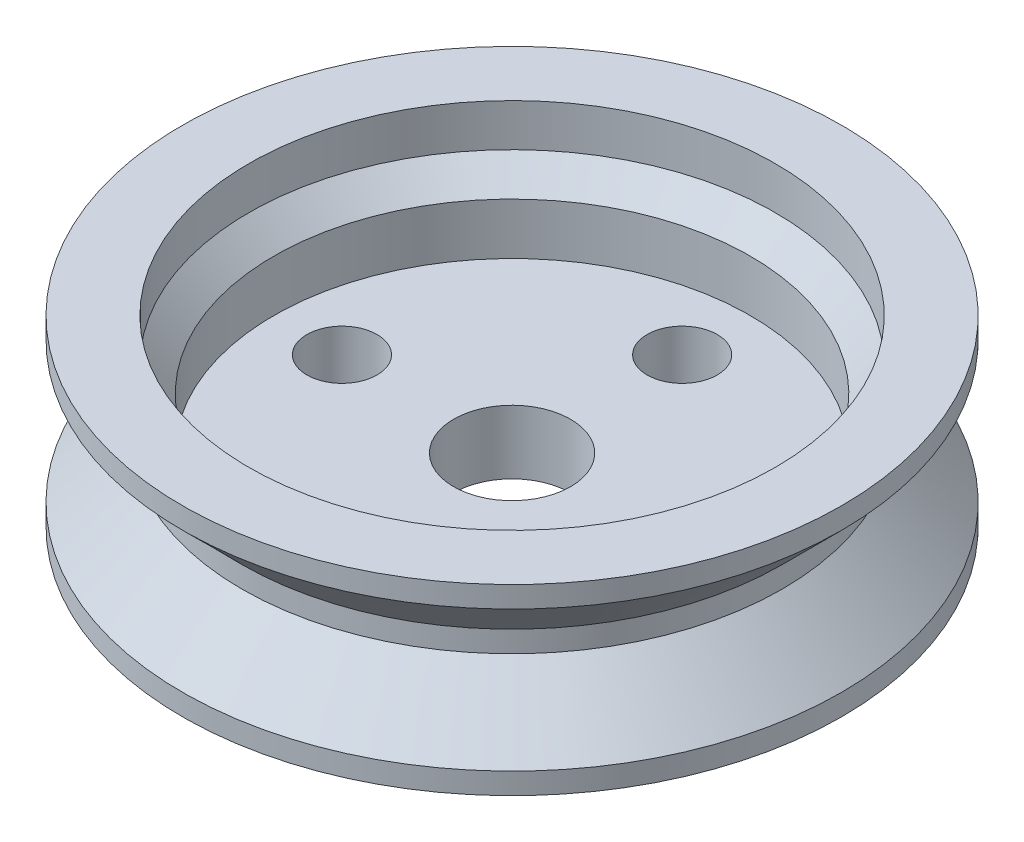
ISO-10303-21;
HEADER;
FILE_DESCRIPTION(('STEP AP214'),'2;1');
FILE_NAME('part.step','',(''),(''),'','','');
FILE_SCHEMA(('AUTOMOTIVE_DESIGN { 1 0 10303 214 1 1 1 1 }'));
ENDSEC;
DATA;
#1=APPLICATION_CONTEXT('core data for automotive mechanical design processes');
#2=APPLICATION_PROTOCOL_DEFINITION('international standard','automotive_design',2000,#1);
#3=PRODUCT_CONTEXT('',#1,'mechanical');
#4=PRODUCT('Part','Part','',(#3));
#5=PRODUCT_RELATED_PRODUCT_CATEGORY('part','',(#4));
#6=PRODUCT_DEFINITION_FORMATION('','',#4);
#7=PRODUCT_DEFINITION_CONTEXT('part definition',#1,'design');
#8=PRODUCT_DEFINITION('design','',#6,#7);
#9=PRODUCT_DEFINITION_SHAPE('','',#8);
#10=(LENGTH_UNIT() NAMED_UNIT(*) SI_UNIT(.MILLI.,.METRE.));
#11=(NAMED_UNIT(*) PLANE_ANGLE_UNIT() SI_UNIT($,.RADIAN.));
#12=(NAMED_UNIT(*) SI_UNIT($,.STERADIAN.) SOLID_ANGLE_UNIT());
#13=UNCERTAINTY_MEASURE_WITH_UNIT(LENGTH_MEASURE(1.E-05),#10,'distance_accuracy_value','');
#14=(GEOMETRIC_REPRESENTATION_CONTEXT(3) GLOBAL_UNCERTAINTY_ASSIGNED_CONTEXT((#13)) GLOBAL_UNIT_ASSIGNED_CONTEXT((#10,
#11,#12)) REPRESENTATION_CONTEXT('',''));
#15=CARTESIAN_POINT('',(0.,0.,0.));
#16=DIRECTION('',(0.,0.,1.));
#17=DIRECTION('',(1.,0.,0.));
#18=AXIS2_PLACEMENT_3D('',#15,#16,#17);
#19=CARTESIAN_POINT('',(0.,0.,0.));
#20=DIRECTION('',(0.,1.,0.));
#21=DIRECTION('',(-1.,0.,0.));
#22=AXIS2_PLACEMENT_3D('',#19,#20,#21);
#23=PLANE('',#22);
#24=CARTESIAN_POINT('',(0.,0.,8.));
#25=DIRECTION('',(0.,-1.,0.));
#26=DIRECTION('',(1.,0.,0.));
#27=AXIS2_PLACEMENT_3D('',#24,#25,#26);
#28=CIRCLE('',#27,1.65);
#29=CARTESIAN_POINT('',(1.65,0.,8.));
#30=VERTEX_POINT('',#29);
#31=EDGE_CURVE('E52',#30,#30,#28,.T.);
#32=ORIENTED_EDGE('',*,*,#31,.F.);
#33=EDGE_LOOP('',(#32));
#34=FACE_BOUND('',#33,.T.);
#35=CARTESIAN_POINT('',(0.,0.,0.));
#36=DIRECTION('',(0.,-1.,0.));
#37=DIRECTION('',(1.,0.,0.));
#38=AXIS2_PLACEMENT_3D('',#35,#36,#37);
#39=CIRCLE('',#38,2.75);
#40=CARTESIAN_POINT('',(2.75,0.,0.));
#41=VERTEX_POINT('',#40);
#42=EDGE_CURVE('E153',#41,#41,#39,.T.);
#43=ORIENTED_EDGE('',*,*,#42,.F.);
#44=EDGE_LOOP('',(#43));
#45=FACE_BOUND('',#44,.T.);
#46=CARTESIAN_POINT('',(8.00000000000023,0.,2.25904099284255E-13));
#47=DIRECTION('',(0.,-1.,0.));
#48=DIRECTION('',(1.,0.,0.));
#49=AXIS2_PLACEMENT_3D('',#46,#47,#48);
#50=CIRCLE('',#49,1.65000000000018);
#51=CARTESIAN_POINT('',(9.6500000000004,0.,2.25904099284255E-13));
#52=VERTEX_POINT('',#51);
#53=EDGE_CURVE('E157',#52,#52,#50,.T.);
#54=ORIENTED_EDGE('',*,*,#53,.F.);
#55=EDGE_LOOP('',(#54));
#56=FACE_BOUND('',#55,.T.);
#57=CARTESIAN_POINT('',(4.51808198568511E-13,0.,-8.));
#58=DIRECTION('',(0.,-1.,0.));
#59=DIRECTION('',(1.,0.,0.));
#60=AXIS2_PLACEMENT_3D('',#57,#58,#59);
#61=CIRCLE('',#60,1.65000000000049);
#62=CARTESIAN_POINT('',(1.65000000000094,0.,-8.));
#63=VERTEX_POINT('',#62);
#64=EDGE_CURVE('E74',#63,#63,#61,.T.);
#65=ORIENTED_EDGE('',*,*,#64,.F.);
#66=EDGE_LOOP('',(#65));
#67=FACE_BOUND('',#66,.T.);
#68=CARTESIAN_POINT('',(-7.99999999999977,0.,-2.26883816723573E-13));
#69=DIRECTION('',(0.,-1.,0.));
#70=DIRECTION('',(1.,0.,0.));
#71=AXIS2_PLACEMENT_3D('',#68,#69,#70);
#72=CIRCLE('',#71,1.65000000000036);
#73=CARTESIAN_POINT('',(-6.34999999999941,0.,-2.26883816723573E-13));
#74=VERTEX_POINT('',#73);
#75=EDGE_CURVE('E163',#74,#74,#72,.T.);
#76=ORIENTED_EDGE('',*,*,#75,.F.);
#77=EDGE_LOOP('',(#76));
#78=FACE_BOUND('',#77,.T.);
#79=CARTESIAN_POINT('',(0.,0.,0.));
#80=DIRECTION('',(0.,-1.,0.));
#81=DIRECTION('',(1.,0.,0.));
#82=AXIS2_PLACEMENT_3D('',#79,#80,#81);
#83=CIRCLE('',#82,15.5);
#84=CARTESIAN_POINT('',(15.5,0.,0.));
#85=VERTEX_POINT('',#84);
#86=EDGE_CURVE('E10',#85,#85,#83,.T.);
#87=ORIENTED_EDGE('',*,*,#86,.T.);
#88=EDGE_LOOP('',(#87));
#89=FACE_BOUND('',#88,.T.);
#90=ADVANCED_FACE('F32',(#34,#45,#56,#67,#78,#89),#23,.F.);
#91=CARTESIAN_POINT('',(0.,0.,0.));
#92=DIRECTION('',(0.,-1.,0.));
#93=DIRECTION('',(1.,0.,0.));
#94=AXIS2_PLACEMENT_3D('',#91,#92,#93);
#95=CYLINDRICAL_SURFACE('',#94,15.5);
#96=ORIENTED_EDGE('',*,*,#86,.F.);
#97=EDGE_LOOP('',(#96));
#98=FACE_BOUND('',#97,.T.);
#99=CARTESIAN_POINT('',(0.,1.,0.));
#100=DIRECTION('',(0.,-1.,0.));
#101=DIRECTION('',(1.,0.,0.));
#102=AXIS2_PLACEMENT_3D('',#99,#100,#101);
#103=CIRCLE('',#102,15.5);
#104=CARTESIAN_POINT('',(15.5,1.,0.));
#105=VERTEX_POINT('',#104);
#106=EDGE_CURVE('E39',#105,#105,#103,.T.);
#107=ORIENTED_EDGE('',*,*,#106,.T.);
#108=EDGE_LOOP('',(#107));
#109=FACE_BOUND('',#108,.T.);
#110=ADVANCED_FACE('F141',(#98,#109),#95,.T.);
#111=CARTESIAN_POINT('',(0.,3.79999999999997,0.));
#112=DIRECTION('',(0.,-1.,0.));
#113=DIRECTION('',(1.,0.,0.));
#114=AXIS2_PLACEMENT_3D('',#111,#112,#113);
#115=CONICAL_SURFACE('',#114,12.7,0.785398163397454);
#116=ORIENTED_EDGE('',*,*,#106,.F.);
#117=EDGE_LOOP('',(#116));
#118=FACE_BOUND('',#117,.T.);
#119=CARTESIAN_POINT('',(0.,3.79999999999997,0.));
#120=DIRECTION('',(0.,-1.,0.));
#121=DIRECTION('',(1.,0.,0.));
#122=AXIS2_PLACEMENT_3D('',#119,#120,#121);
#123=CIRCLE('',#122,12.7);
#124=CARTESIAN_POINT('',(12.7,3.79999999999997,0.));
#125=VERTEX_POINT('',#124);
#126=EDGE_CURVE('E44',#125,#125,#123,.T.);
#127=ORIENTED_EDGE('',*,*,#126,.T.);
#128=EDGE_LOOP('',(#127));
#129=FACE_BOUND('',#128,.T.);
#130=ADVANCED_FACE('F93',(#118,#129),#115,.T.);
#131=CARTESIAN_POINT('',(0.,0.,0.));
#132=DIRECTION('',(0.,-1.,0.));
#133=DIRECTION('',(1.,0.,0.));
#134=AXIS2_PLACEMENT_3D('',#131,#132,#133);
#135=CYLINDRICAL_SURFACE('',#134,12.7);
#136=ORIENTED_EDGE('',*,*,#126,.F.);
#137=EDGE_LOOP('',(#136));
#138=FACE_BOUND('',#137,.T.);
#139=CARTESIAN_POINT('',(0.,4.79999999999997,0.));
#140=DIRECTION('',(0.,-1.,0.));
#141=DIRECTION('',(1.,0.,0.));
#142=AXIS2_PLACEMENT_3D('',#139,#140,#141);
#143=CIRCLE('',#142,12.7);
#144=CARTESIAN_POINT('',(12.7,4.79999999999997,0.));
#145=VERTEX_POINT('',#144);
#146=EDGE_CURVE('E88',#145,#145,#143,.T.);
#147=ORIENTED_EDGE('',*,*,#146,.T.);
#148=EDGE_LOOP('',(#147));
#149=FACE_BOUND('',#148,.T.);
#150=ADVANCED_FACE('F95',(#138,#149),#135,.T.);
#151=CARTESIAN_POINT('',(0.,7.59999999999994,0.));
#152=DIRECTION('',(0.,1.,0.));
#153=DIRECTION('',(-1.,0.,0.));
#154=AXIS2_PLACEMENT_3D('',#151,#152,#153);
#155=CONICAL_SURFACE('',#154,15.5,0.785398163397454);
#156=ORIENTED_EDGE('',*,*,#146,.F.);
#157=EDGE_LOOP('',(#156));
#158=FACE_BOUND('',#157,.T.);
#159=CARTESIAN_POINT('',(0.,7.59999999999994,0.));
#160=DIRECTION('',(0.,-1.,0.));
#161=DIRECTION('',(1.,0.,0.));
#162=AXIS2_PLACEMENT_3D('',#159,#160,#161);
#163=CIRCLE('',#162,15.5);
#164=CARTESIAN_POINT('',(15.5,7.59999999999994,0.));
#165=VERTEX_POINT('',#164);
#166=EDGE_CURVE('E85',#165,#165,#163,.T.);
#167=ORIENTED_EDGE('',*,*,#166,.T.);
#168=EDGE_LOOP('',(#167));
#169=FACE_BOUND('',#168,.T.);
#170=ADVANCED_FACE('F98',(#158,#169),#155,.T.);
#171=CARTESIAN_POINT('',(0.,0.,0.));
#172=DIRECTION('',(0.,-1.,0.));
#173=DIRECTION('',(1.,0.,0.));
#174=AXIS2_PLACEMENT_3D('',#171,#172,#173);
#175=CYLINDRICAL_SURFACE('',#174,15.5);
#176=ORIENTED_EDGE('',*,*,#166,.F.);
#177=EDGE_LOOP('',(#176));
#178=FACE_BOUND('',#177,.T.);
#179=CARTESIAN_POINT('',(0.,8.59999999999994,0.));
#180=DIRECTION('',(0.,-1.,0.));
#181=DIRECTION('',(1.,0.,0.));
#182=AXIS2_PLACEMENT_3D('',#179,#180,#181);
#183=CIRCLE('',#182,15.5);
#184=CARTESIAN_POINT('',(15.5,8.59999999999994,0.));
#185=VERTEX_POINT('',#184);
#186=EDGE_CURVE('E82',#185,#185,#183,.T.);
#187=ORIENTED_EDGE('',*,*,#186,.T.);
#188=EDGE_LOOP('',(#187));
#189=FACE_BOUND('',#188,.T.);
#190=ADVANCED_FACE('F104',(#178,#189),#175,.T.);
#191=CARTESIAN_POINT('',(-15.5,8.59999999999994,0.));
#192=DIRECTION('',(0.,-1.,0.));
#193=DIRECTION('',(1.,0.,0.));
#194=AXIS2_PLACEMENT_3D('',#191,#192,#193);
#195=PLANE('',#194);
#196=ORIENTED_EDGE('',*,*,#186,.F.);
#197=EDGE_LOOP('',(#196));
#198=FACE_BOUND('',#197,.T.);
#199=CARTESIAN_POINT('',(0.,8.59999999999994,0.));
#200=DIRECTION('',(0.,-1.,0.));
#201=DIRECTION('',(1.,0.,0.));
#202=AXIS2_PLACEMENT_3D('',#199,#200,#201);
#203=CIRCLE('',#202,12.3786796564403);
#204=CARTESIAN_POINT('',(12.3786796564403,8.59999999999994,0.));
#205=VERTEX_POINT('',#204);
#206=EDGE_CURVE('E79',#205,#205,#203,.T.);
#207=ORIENTED_EDGE('',*,*,#206,.T.);
#208=EDGE_LOOP('',(#207));
#209=FACE_BOUND('',#208,.T.);
#210=ADVANCED_FACE('F110',(#198,#209),#195,.F.);
#211=CARTESIAN_POINT('',(0.,0.,0.));
#212=DIRECTION('',(0.,-1.,0.));
#213=DIRECTION('',(1.,0.,0.));
#214=AXIS2_PLACEMENT_3D('',#211,#212,#213);
#215=CYLINDRICAL_SURFACE('',#214,12.3786796564403);
#216=ORIENTED_EDGE('',*,*,#206,.F.);
#217=EDGE_LOOP('',(#216));
#218=FACE_BOUND('',#217,.T.);
#219=CARTESIAN_POINT('',(0.,6.59999999999994,0.));
#220=DIRECTION('',(0.,-1.,0.));
#221=DIRECTION('',(1.,0.,0.));
#222=AXIS2_PLACEMENT_3D('',#219,#220,#221);
#223=CIRCLE('',#222,12.3786796564403);
#224=CARTESIAN_POINT('',(12.3786796564403,6.59999999999994,0.));
#225=VERTEX_POINT('',#224);
#226=EDGE_CURVE('E71',#225,#225,#223,.T.);
#227=ORIENTED_EDGE('',*,*,#226,.T.);
#228=EDGE_LOOP('',(#227));
#229=FACE_BOUND('',#228,.T.);
#230=ADVANCED_FACE('F116',(#218,#229),#215,.F.);
#231=CARTESIAN_POINT('',(0.,5.42132034355962,0.));
#232=DIRECTION('',(0.,1.,0.));
#233=DIRECTION('',(-1.,0.,0.));
#234=AXIS2_PLACEMENT_3D('',#231,#232,#233);
#235=CONICAL_SURFACE('',#234,11.2,0.785398163397453);
#236=ORIENTED_EDGE('',*,*,#226,.F.);
#237=EDGE_LOOP('',(#236));
#238=FACE_BOUND('',#237,.T.);
#239=CARTESIAN_POINT('',(0.,5.42132034355962,0.));
#240=DIRECTION('',(0.,-1.,0.));
#241=DIRECTION('',(1.,0.,0.));
#242=AXIS2_PLACEMENT_3D('',#239,#240,#241);
#243=CIRCLE('',#242,11.2);
#244=CARTESIAN_POINT('',(11.2,5.42132034355962,0.));
#245=VERTEX_POINT('',#244);
#246=EDGE_CURVE('E66',#245,#245,#243,.T.);
#247=ORIENTED_EDGE('',*,*,#246,.T.);
#248=EDGE_LOOP('',(#247));
#249=FACE_BOUND('',#248,.T.);
#250=ADVANCED_FACE('F122',(#238,#249),#235,.F.);
#251=CARTESIAN_POINT('',(0.,0.,0.));
#252=DIRECTION('',(0.,-1.,0.));
#253=DIRECTION('',(1.,0.,0.));
#254=AXIS2_PLACEMENT_3D('',#251,#252,#253);
#255=CYLINDRICAL_SURFACE('',#254,11.2);
#256=ORIENTED_EDGE('',*,*,#246,.F.);
#257=EDGE_LOOP('',(#256));
#258=FACE_BOUND('',#257,.T.);
#259=CARTESIAN_POINT('',(0.,3.,0.));
#260=DIRECTION('',(0.,-1.,0.));
#261=DIRECTION('',(1.,0.,0.));
#262=AXIS2_PLACEMENT_3D('',#259,#260,#261);
#263=CIRCLE('',#262,11.2);
#264=CARTESIAN_POINT('',(11.2,3.,0.));
#265=VERTEX_POINT('',#264);
#266=EDGE_CURVE('E62',#265,#265,#263,.T.);
#267=ORIENTED_EDGE('',*,*,#266,.T.);
#268=EDGE_LOOP('',(#267));
#269=FACE_BOUND('',#268,.T.);
#270=ADVANCED_FACE('F128',(#258,#269),#255,.F.);
#271=CARTESIAN_POINT('',(-11.2,3.,0.));
#272=DIRECTION('',(0.,-1.,0.));
#273=DIRECTION('',(1.,0.,0.));
#274=AXIS2_PLACEMENT_3D('',#271,#272,#273);
#275=PLANE('',#274);
#276=CARTESIAN_POINT('',(0.,3.,8.));
#277=DIRECTION('',(0.,-1.,0.));
#278=DIRECTION('',(1.,0.,0.));
#279=AXIS2_PLACEMENT_3D('',#276,#277,#278);
#280=CIRCLE('',#279,1.65);
#281=CARTESIAN_POINT('',(1.65,3.,8.));
#282=VERTEX_POINT('',#281);
#283=EDGE_CURVE('E35',#282,#282,#280,.T.);
#284=ORIENTED_EDGE('',*,*,#283,.T.);
#285=EDGE_LOOP('',(#284));
#286=FACE_BOUND('',#285,.T.);
#287=CARTESIAN_POINT('',(0.,3.,0.));
#288=DIRECTION('',(0.,-1.,0.));
#289=DIRECTION('',(1.,0.,0.));
#290=AXIS2_PLACEMENT_3D('',#287,#288,#289);
#291=CIRCLE('',#290,2.75);
#292=CARTESIAN_POINT('',(2.75,3.,0.));
#293=VERTEX_POINT('',#292);
#294=EDGE_CURVE('E57',#293,#293,#291,.T.);
#295=ORIENTED_EDGE('',*,*,#294,.T.);
#296=EDGE_LOOP('',(#295));
#297=FACE_BOUND('',#296,.T.);
#298=CARTESIAN_POINT('',(8.00000000000022,3.,2.25904099284255E-13));
#299=DIRECTION('',(0.,-1.,0.));
#300=DIRECTION('',(1.,0.,0.));
#301=AXIS2_PLACEMENT_3D('',#298,#299,#300);
#302=CIRCLE('',#301,1.65000000000018);
#303=CARTESIAN_POINT('',(9.6500000000004,3.,2.25904099284255E-13));
#304=VERTEX_POINT('',#303);
#305=EDGE_CURVE('E55',#304,#304,#302,.T.);
#306=ORIENTED_EDGE('',*,*,#305,.T.);
#307=EDGE_LOOP('',(#306));
#308=FACE_BOUND('',#307,.T.);
#309=CARTESIAN_POINT('',(4.51440804528766E-13,3.,-8.));
#310=DIRECTION('',(0.,-1.,0.));
#311=DIRECTION('',(1.,0.,0.));
#312=AXIS2_PLACEMENT_3D('',#309,#310,#311);
#313=CIRCLE('',#312,1.65000000000049);
#314=CARTESIAN_POINT('',(1.65000000000094,3.,-8.));
#315=VERTEX_POINT('',#314);
#316=EDGE_CURVE('E51',#315,#315,#313,.T.);
#317=ORIENTED_EDGE('',*,*,#316,.T.);
#318=EDGE_LOOP('',(#317));
#319=FACE_BOUND('',#318,.T.);
#320=CARTESIAN_POINT('',(-7.99999999999978,3.,-2.26883816723573E-13));
#321=DIRECTION('',(0.,-1.,0.));
#322=DIRECTION('',(1.,0.,0.));
#323=AXIS2_PLACEMENT_3D('',#320,#321,#322);
#324=CIRCLE('',#323,1.65000000000036);
#325=CARTESIAN_POINT('',(-6.34999999999941,3.,-2.26883816723573E-13));
#326=VERTEX_POINT('',#325);
#327=EDGE_CURVE('E48',#326,#326,#324,.T.);
#328=ORIENTED_EDGE('',*,*,#327,.T.);
#329=EDGE_LOOP('',(#328));
#330=FACE_BOUND('',#329,.T.);
#331=ORIENTED_EDGE('',*,*,#266,.F.);
#332=EDGE_LOOP('',(#331));
#333=FACE_BOUND('',#332,.T.);
#334=ADVANCED_FACE('F133',(#286,#297,#308,#319,#330,#333),#275,.F.);
#335=CARTESIAN_POINT('',(-7.99999999999978,8.59999999999994,-2.26883816723573E-13));
#336=DIRECTION('',(0.,-1.,0.));
#337=DIRECTION('',(1.,0.,0.));
#338=AXIS2_PLACEMENT_3D('',#335,#336,#337);
#339=CYLINDRICAL_SURFACE('',#338,1.65000000000036);
#340=ORIENTED_EDGE('',*,*,#75,.T.);
#341=EDGE_LOOP('',(#340));
#342=FACE_BOUND('',#341,.T.);
#343=ORIENTED_EDGE('',*,*,#327,.F.);
#344=EDGE_LOOP('',(#343));
#345=FACE_BOUND('',#344,.T.);
#346=ADVANCED_FACE('F138',(#342,#345),#339,.F.);
#347=CARTESIAN_POINT('',(4.50755002321244E-13,8.59999999999994,-8.));
#348=DIRECTION('',(0.,-1.,0.));
#349=DIRECTION('',(1.,0.,0.));
#350=AXIS2_PLACEMENT_3D('',#347,#348,#349);
#351=CYLINDRICAL_SURFACE('',#350,1.65000000000049);
#352=ORIENTED_EDGE('',*,*,#64,.T.);
#353=EDGE_LOOP('',(#352));
#354=FACE_BOUND('',#353,.T.);
#355=ORIENTED_EDGE('',*,*,#316,.F.);
#356=EDGE_LOOP('',(#355));
#357=FACE_BOUND('',#356,.T.);
#358=ADVANCED_FACE('F173',(#354,#357),#351,.F.);
#359=CARTESIAN_POINT('',(8.00000000000022,8.59999999999994,2.25904099284255E-13));
#360=DIRECTION('',(0.,-1.,0.));
#361=DIRECTION('',(1.,0.,0.));
#362=AXIS2_PLACEMENT_3D('',#359,#360,#361);
#363=CYLINDRICAL_SURFACE('',#362,1.65000000000018);
#364=ORIENTED_EDGE('',*,*,#53,.T.);
#365=EDGE_LOOP('',(#364));
#366=FACE_BOUND('',#365,.T.);
#367=ORIENTED_EDGE('',*,*,#305,.F.);
#368=EDGE_LOOP('',(#367));
#369=FACE_BOUND('',#368,.T.);
#370=ADVANCED_FACE('F169',(#366,#369),#363,.F.);
#371=CARTESIAN_POINT('',(0.,8.59999999999994,0.));
#372=DIRECTION('',(0.,-1.,0.));
#373=DIRECTION('',(1.,0.,0.));
#374=AXIS2_PLACEMENT_3D('',#371,#372,#373);
#375=CYLINDRICAL_SURFACE('',#374,2.75);
#376=ORIENTED_EDGE('',*,*,#42,.T.);
#377=EDGE_LOOP('',(#376));
#378=FACE_BOUND('',#377,.T.);
#379=ORIENTED_EDGE('',*,*,#294,.F.);
#380=EDGE_LOOP('',(#379));
#381=FACE_BOUND('',#380,.T.);
#382=ADVANCED_FACE('F172',(#378,#381),#375,.F.);
#383=CARTESIAN_POINT('',(0.,8.59999999999994,8.));
#384=DIRECTION('',(0.,-1.,0.));
#385=DIRECTION('',(1.,0.,0.));
#386=AXIS2_PLACEMENT_3D('',#383,#384,#385);
#387=CYLINDRICAL_SURFACE('',#386,1.65);
#388=ORIENTED_EDGE('',*,*,#31,.T.);
#389=EDGE_LOOP('',(#388));
#390=FACE_BOUND('',#389,.T.);
#391=ORIENTED_EDGE('',*,*,#283,.F.);
#392=EDGE_LOOP('',(#391));
#393=FACE_BOUND('',#392,.T.);
#394=ADVANCED_FACE('F192',(#390,#393),#387,.F.);
#395=CLOSED_SHELL('',(#90,#110,#130,#150,#170,#190,#210,#230,#250,#270,#334,#346,#358,#370,#382,#394));
#396=MANIFOLD_SOLID_BREP('B2',#395);
#397=ADVANCED_BREP_SHAPE_REPRESENTATION('',(#18,#396),#14);
#398=SHAPE_DEFINITION_REPRESENTATION(#9,#397);
ENDSEC;
END-ISO-10303-21;
